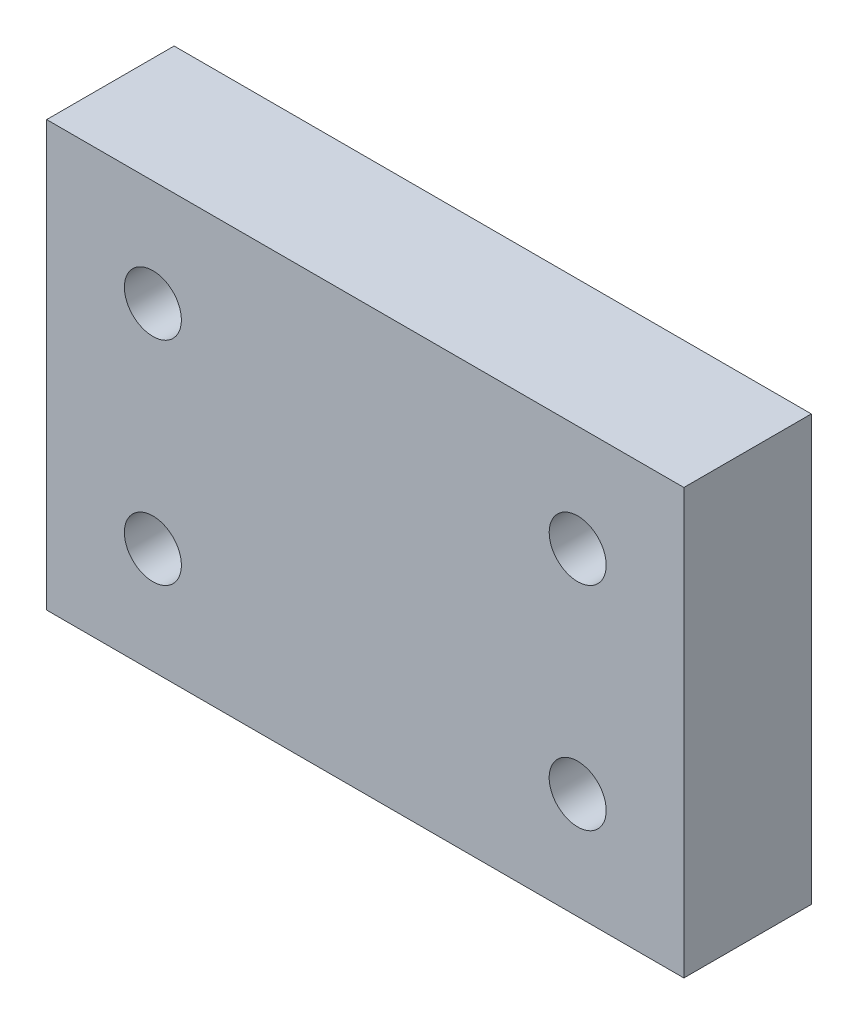
ISO-10303-21;
HEADER;
FILE_DESCRIPTION(('STEP AP214'),'2;1');
FILE_NAME('part.step','',(''),(''),'','','');
FILE_SCHEMA(('AUTOMOTIVE_DESIGN { 1 0 10303 214 1 1 1 1 }'));
ENDSEC;
DATA;
#1=APPLICATION_CONTEXT('core data for automotive mechanical design processes');
#2=APPLICATION_PROTOCOL_DEFINITION('international standard','automotive_design',2000,#1);
#3=PRODUCT_CONTEXT('',#1,'mechanical');
#4=PRODUCT('Part','Part','',(#3));
#5=PRODUCT_RELATED_PRODUCT_CATEGORY('part','',(#4));
#6=PRODUCT_DEFINITION_FORMATION('','',#4);
#7=PRODUCT_DEFINITION_CONTEXT('part definition',#1,'design');
#8=PRODUCT_DEFINITION('design','',#6,#7);
#9=PRODUCT_DEFINITION_SHAPE('','',#8);
#10=(LENGTH_UNIT() NAMED_UNIT(*) SI_UNIT(.MILLI.,.METRE.));
#11=(NAMED_UNIT(*) PLANE_ANGLE_UNIT() SI_UNIT($,.RADIAN.));
#12=(NAMED_UNIT(*) SI_UNIT($,.STERADIAN.) SOLID_ANGLE_UNIT());
#13=UNCERTAINTY_MEASURE_WITH_UNIT(LENGTH_MEASURE(1.E-05),#10,'distance_accuracy_value','');
#14=(GEOMETRIC_REPRESENTATION_CONTEXT(3) GLOBAL_UNCERTAINTY_ASSIGNED_CONTEXT((#13)) GLOBAL_UNIT_ASSIGNED_CONTEXT((#10,
#11,#12)) REPRESENTATION_CONTEXT('',''));
#15=CARTESIAN_POINT('',(0.,0.,0.));
#16=DIRECTION('',(0.,0.,1.));
#17=DIRECTION('',(1.,0.,0.));
#18=AXIS2_PLACEMENT_3D('',#15,#16,#17);
#19=CARTESIAN_POINT('',(0.,0.,6.));
#20=DIRECTION('',(0.,0.,-1.));
#21=DIRECTION('',(-1.,0.,0.));
#22=AXIS2_PLACEMENT_3D('',#19,#20,#21);
#23=PLANE('',#22);
#24=CARTESIAN_POINT('',(25.,5.,6.));
#25=DIRECTION('',(0.,0.,1.));
#26=DIRECTION('',(1.,0.,0.));
#27=AXIS2_PLACEMENT_3D('',#24,#25,#26);
#28=CIRCLE('',#27,1.34180855128207);
#29=CARTESIAN_POINT('',(26.3418085512821,5.,6.));
#30=VERTEX_POINT('',#29);
#31=EDGE_CURVE('E120',#30,#30,#28,.T.);
#32=ORIENTED_EDGE('',*,*,#31,.F.);
#33=EDGE_LOOP('',(#32));
#34=FACE_BOUND('',#33,.T.);
#35=CARTESIAN_POINT('',(5.,15.,6.));
#36=DIRECTION('',(0.,0.,1.));
#37=DIRECTION('',(1.,0.,0.));
#38=AXIS2_PLACEMENT_3D('',#35,#36,#37);
#39=CIRCLE('',#38,1.34180855128207);
#40=CARTESIAN_POINT('',(6.34180855128207,15.,6.));
#41=VERTEX_POINT('',#40);
#42=EDGE_CURVE('E99',#41,#41,#39,.T.);
#43=ORIENTED_EDGE('',*,*,#42,.F.);
#44=EDGE_LOOP('',(#43));
#45=FACE_BOUND('',#44,.T.);
#46=DIRECTION('',(0.,-1.,0.));
#47=VECTOR('',#46,1.);
#48=CARTESIAN_POINT('',(0.,0.,6.));
#49=LINE('',#48,#47);
#50=CARTESIAN_POINT('',(0.,20.,6.));
#51=VERTEX_POINT('',#50);
#52=CARTESIAN_POINT('',(0.,0.,6.));
#53=VERTEX_POINT('',#52);
#54=EDGE_CURVE('E84',#51,#53,#49,.T.);
#55=ORIENTED_EDGE('',*,*,#54,.T.);
#56=DIRECTION('',(1.,0.,0.));
#57=VECTOR('',#56,1.);
#58=CARTESIAN_POINT('',(0.,0.,6.));
#59=LINE('',#58,#57);
#60=CARTESIAN_POINT('',(30.,0.,6.));
#61=VERTEX_POINT('',#60);
#62=EDGE_CURVE('E79',#53,#61,#59,.T.);
#63=ORIENTED_EDGE('',*,*,#62,.T.);
#64=DIRECTION('',(0.,1.,0.));
#65=VECTOR('',#64,1.);
#66=CARTESIAN_POINT('',(30.,0.,6.));
#67=LINE('',#66,#65);
#68=CARTESIAN_POINT('',(30.,20.,6.));
#69=VERTEX_POINT('',#68);
#70=EDGE_CURVE('E82',#61,#69,#67,.T.);
#71=ORIENTED_EDGE('',*,*,#70,.T.);
#72=DIRECTION('',(-1.,0.,0.));
#73=VECTOR('',#72,1.);
#74=CARTESIAN_POINT('',(0.,20.,6.));
#75=LINE('',#74,#73);
#76=EDGE_CURVE('E49',#69,#51,#75,.T.);
#77=ORIENTED_EDGE('',*,*,#76,.T.);
#78=EDGE_LOOP('',(#55,#63,#71,#77));
#79=FACE_BOUND('',#78,.T.);
#80=CARTESIAN_POINT('',(25.,15.,6.));
#81=DIRECTION('',(0.,0.,1.));
#82=DIRECTION('',(-1.,0.,0.));
#83=AXIS2_PLACEMENT_3D('',#80,#81,#82);
#84=CIRCLE('',#83,1.34180855128207);
#85=CARTESIAN_POINT('',(23.6581914487179,15.,6.));
#86=VERTEX_POINT('',#85);
#87=EDGE_CURVE('E114',#86,#86,#84,.T.);
#88=ORIENTED_EDGE('',*,*,#87,.F.);
#89=EDGE_LOOP('',(#88));
#90=FACE_BOUND('',#89,.T.);
#91=CARTESIAN_POINT('',(5.,5.,6.));
#92=DIRECTION('',(0.,0.,1.));
#93=DIRECTION('',(-1.,0.,0.));
#94=AXIS2_PLACEMENT_3D('',#91,#92,#93);
#95=CIRCLE('',#94,1.34180855128207);
#96=CARTESIAN_POINT('',(3.65819144871793,5.,6.));
#97=VERTEX_POINT('',#96);
#98=EDGE_CURVE('E126',#97,#97,#95,.T.);
#99=ORIENTED_EDGE('',*,*,#98,.F.);
#100=EDGE_LOOP('',(#99));
#101=FACE_BOUND('',#100,.T.);
#102=ADVANCED_FACE('F32',(#34,#45,#79,#90,#101),#23,.F.);
#103=CARTESIAN_POINT('',(0.,0.,0.));
#104=DIRECTION('',(0.,0.,-1.));
#105=DIRECTION('',(-1.,0.,0.));
#106=AXIS2_PLACEMENT_3D('',#103,#104,#105);
#107=PLANE('',#106);
#108=CARTESIAN_POINT('',(25.,5.,0.));
#109=DIRECTION('',(0.,0.,1.));
#110=DIRECTION('',(1.,0.,0.));
#111=AXIS2_PLACEMENT_3D('',#108,#109,#110);
#112=CIRCLE('',#111,1.34180855128207);
#113=CARTESIAN_POINT('',(26.3418085512821,5.,0.));
#114=VERTEX_POINT('',#113);
#115=EDGE_CURVE('E123',#114,#114,#112,.T.);
#116=ORIENTED_EDGE('',*,*,#115,.T.);
#117=EDGE_LOOP('',(#116));
#118=FACE_BOUND('',#117,.T.);
#119=CARTESIAN_POINT('',(5.,15.,0.));
#120=DIRECTION('',(0.,0.,1.));
#121=DIRECTION('',(1.,0.,0.));
#122=AXIS2_PLACEMENT_3D('',#119,#120,#121);
#123=CIRCLE('',#122,1.34180855128207);
#124=CARTESIAN_POINT('',(6.34180855128207,15.,0.));
#125=VERTEX_POINT('',#124);
#126=EDGE_CURVE('E111',#125,#125,#123,.T.);
#127=ORIENTED_EDGE('',*,*,#126,.T.);
#128=EDGE_LOOP('',(#127));
#129=FACE_BOUND('',#128,.T.);
#130=DIRECTION('',(0.,-1.,0.));
#131=VECTOR('',#130,1.);
#132=CARTESIAN_POINT('',(0.,0.,0.));
#133=LINE('',#132,#131);
#134=CARTESIAN_POINT('',(0.,20.,0.));
#135=VERTEX_POINT('',#134);
#136=CARTESIAN_POINT('',(0.,0.,0.));
#137=VERTEX_POINT('',#136);
#138=EDGE_CURVE('E96',#135,#137,#133,.T.);
#139=ORIENTED_EDGE('',*,*,#138,.F.);
#140=DIRECTION('',(-1.,0.,0.));
#141=VECTOR('',#140,1.);
#142=CARTESIAN_POINT('',(0.,20.,0.));
#143=LINE('',#142,#141);
#144=CARTESIAN_POINT('',(30.,20.,0.));
#145=VERTEX_POINT('',#144);
#146=EDGE_CURVE('E72',#145,#135,#143,.T.);
#147=ORIENTED_EDGE('',*,*,#146,.F.);
#148=DIRECTION('',(0.,1.,0.));
#149=VECTOR('',#148,1.);
#150=CARTESIAN_POINT('',(30.,0.,0.));
#151=LINE('',#150,#149);
#152=CARTESIAN_POINT('',(30.,0.,0.));
#153=VERTEX_POINT('',#152);
#154=EDGE_CURVE('E66',#153,#145,#151,.T.);
#155=ORIENTED_EDGE('',*,*,#154,.F.);
#156=DIRECTION('',(1.,0.,0.));
#157=VECTOR('',#156,1.);
#158=CARTESIAN_POINT('',(0.,0.,0.));
#159=LINE('',#158,#157);
#160=EDGE_CURVE('E88',#137,#153,#159,.T.);
#161=ORIENTED_EDGE('',*,*,#160,.F.);
#162=EDGE_LOOP('',(#139,#147,#155,#161));
#163=FACE_BOUND('',#162,.T.);
#164=CARTESIAN_POINT('',(25.,15.,0.));
#165=DIRECTION('',(0.,0.,1.));
#166=DIRECTION('',(-1.,0.,0.));
#167=AXIS2_PLACEMENT_3D('',#164,#165,#166);
#168=CIRCLE('',#167,1.34180855128207);
#169=CARTESIAN_POINT('',(23.6581914487179,15.,0.));
#170=VERTEX_POINT('',#169);
#171=EDGE_CURVE('E117',#170,#170,#168,.T.);
#172=ORIENTED_EDGE('',*,*,#171,.T.);
#173=EDGE_LOOP('',(#172));
#174=FACE_BOUND('',#173,.T.);
#175=CARTESIAN_POINT('',(5.,5.,0.));
#176=DIRECTION('',(0.,0.,1.));
#177=DIRECTION('',(-1.,0.,0.));
#178=AXIS2_PLACEMENT_3D('',#175,#176,#177);
#179=CIRCLE('',#178,1.34180855128207);
#180=CARTESIAN_POINT('',(3.65819144871793,5.,0.));
#181=VERTEX_POINT('',#180);
#182=EDGE_CURVE('E129',#181,#181,#179,.T.);
#183=ORIENTED_EDGE('',*,*,#182,.T.);
#184=EDGE_LOOP('',(#183));
#185=FACE_BOUND('',#184,.T.);
#186=ADVANCED_FACE('F107',(#118,#129,#163,#174,#185),#107,.T.);
#187=CARTESIAN_POINT('',(0.,0.,6.));
#188=DIRECTION('',(1.,0.,0.));
#189=DIRECTION('',(0.,0.,-1.));
#190=AXIS2_PLACEMENT_3D('',#187,#188,#189);
#191=PLANE('',#190);
#192=ORIENTED_EDGE('',*,*,#138,.T.);
#193=DIRECTION('',(0.,0.,-1.));
#194=VECTOR('',#193,1.);
#195=CARTESIAN_POINT('',(0.,0.,6.));
#196=LINE('',#195,#194);
#197=EDGE_CURVE('E11',#53,#137,#196,.T.);
#198=ORIENTED_EDGE('',*,*,#197,.F.);
#199=ORIENTED_EDGE('',*,*,#54,.F.);
#200=DIRECTION('',(0.,0.,-1.));
#201=VECTOR('',#200,1.);
#202=CARTESIAN_POINT('',(0.,20.,6.));
#203=LINE('',#202,#201);
#204=EDGE_CURVE('E92',#51,#135,#203,.T.);
#205=ORIENTED_EDGE('',*,*,#204,.T.);
#206=EDGE_LOOP('',(#192,#198,#199,#205));
#207=FACE_BOUND('',#206,.T.);
#208=ADVANCED_FACE('F34',(#207),#191,.F.);
#209=CARTESIAN_POINT('',(0.,0.,6.));
#210=DIRECTION('',(0.,1.,0.));
#211=DIRECTION('',(0.,0.,1.));
#212=AXIS2_PLACEMENT_3D('',#209,#210,#211);
#213=PLANE('',#212);
#214=ORIENTED_EDGE('',*,*,#160,.T.);
#215=DIRECTION('',(0.,0.,-1.));
#216=VECTOR('',#215,1.);
#217=CARTESIAN_POINT('',(30.,0.,6.));
#218=LINE('',#217,#216);
#219=EDGE_CURVE('E41',#61,#153,#218,.T.);
#220=ORIENTED_EDGE('',*,*,#219,.F.);
#221=ORIENTED_EDGE('',*,*,#62,.F.);
#222=ORIENTED_EDGE('',*,*,#197,.T.);
#223=EDGE_LOOP('',(#214,#220,#221,#222));
#224=FACE_BOUND('',#223,.T.);
#225=ADVANCED_FACE('F87',(#224),#213,.F.);
#226=CARTESIAN_POINT('',(30.,0.,6.));
#227=DIRECTION('',(-1.,0.,0.));
#228=DIRECTION('',(0.,0.,1.));
#229=AXIS2_PLACEMENT_3D('',#226,#227,#228);
#230=PLANE('',#229);
#231=ORIENTED_EDGE('',*,*,#154,.T.);
#232=DIRECTION('',(0.,0.,-1.));
#233=VECTOR('',#232,1.);
#234=CARTESIAN_POINT('',(30.,20.,6.));
#235=LINE('',#234,#233);
#236=EDGE_CURVE('E89',#69,#145,#235,.T.);
#237=ORIENTED_EDGE('',*,*,#236,.F.);
#238=ORIENTED_EDGE('',*,*,#70,.F.);
#239=ORIENTED_EDGE('',*,*,#219,.T.);
#240=EDGE_LOOP('',(#231,#237,#238,#239));
#241=FACE_BOUND('',#240,.T.);
#242=ADVANCED_FACE('F90',(#241),#230,.F.);
#243=CARTESIAN_POINT('',(0.,20.,6.));
#244=DIRECTION('',(0.,-1.,0.));
#245=DIRECTION('',(0.,0.,-1.));
#246=AXIS2_PLACEMENT_3D('',#243,#244,#245);
#247=PLANE('',#246);
#248=ORIENTED_EDGE('',*,*,#146,.T.);
#249=ORIENTED_EDGE('',*,*,#204,.F.);
#250=ORIENTED_EDGE('',*,*,#76,.F.);
#251=ORIENTED_EDGE('',*,*,#236,.T.);
#252=EDGE_LOOP('',(#248,#249,#250,#251));
#253=FACE_BOUND('',#252,.T.);
#254=ADVANCED_FACE('F104',(#253),#247,.F.);
#255=CARTESIAN_POINT('',(5.,15.,6.));
#256=DIRECTION('',(0.,0.,-1.));
#257=DIRECTION('',(-1.,0.,0.));
#258=AXIS2_PLACEMENT_3D('',#255,#256,#257);
#259=CYLINDRICAL_SURFACE('',#258,1.34180855128207);
#260=ORIENTED_EDGE('',*,*,#42,.T.);
#261=EDGE_LOOP('',(#260));
#262=FACE_BOUND('',#261,.T.);
#263=ORIENTED_EDGE('',*,*,#126,.F.);
#264=EDGE_LOOP('',(#263));
#265=FACE_BOUND('',#264,.T.);
#266=ADVANCED_FACE('F149',(#262,#265),#259,.F.);
#267=CARTESIAN_POINT('',(25.,15.,6.));
#268=DIRECTION('',(0.,0.,-1.));
#269=DIRECTION('',(-1.,0.,0.));
#270=AXIS2_PLACEMENT_3D('',#267,#268,#269);
#271=CYLINDRICAL_SURFACE('',#270,1.34180855128207);
#272=ORIENTED_EDGE('',*,*,#87,.T.);
#273=EDGE_LOOP('',(#272));
#274=FACE_BOUND('',#273,.T.);
#275=ORIENTED_EDGE('',*,*,#171,.F.);
#276=EDGE_LOOP('',(#275));
#277=FACE_BOUND('',#276,.T.);
#278=ADVANCED_FACE('F195',(#274,#277),#271,.F.);
#279=CARTESIAN_POINT('',(25.,5.,6.));
#280=DIRECTION('',(0.,0.,-1.));
#281=DIRECTION('',(-1.,0.,0.));
#282=AXIS2_PLACEMENT_3D('',#279,#280,#281);
#283=CYLINDRICAL_SURFACE('',#282,1.34180855128207);
#284=ORIENTED_EDGE('',*,*,#31,.T.);
#285=EDGE_LOOP('',(#284));
#286=FACE_BOUND('',#285,.T.);
#287=ORIENTED_EDGE('',*,*,#115,.F.);
#288=EDGE_LOOP('',(#287));
#289=FACE_BOUND('',#288,.T.);
#290=ADVANCED_FACE('F203',(#286,#289),#283,.F.);
#291=CARTESIAN_POINT('',(5.,5.,6.));
#292=DIRECTION('',(0.,0.,-1.));
#293=DIRECTION('',(-1.,0.,0.));
#294=AXIS2_PLACEMENT_3D('',#291,#292,#293);
#295=CYLINDRICAL_SURFACE('',#294,1.34180855128207);
#296=ORIENTED_EDGE('',*,*,#98,.T.);
#297=EDGE_LOOP('',(#296));
#298=FACE_BOUND('',#297,.T.);
#299=ORIENTED_EDGE('',*,*,#182,.F.);
#300=EDGE_LOOP('',(#299));
#301=FACE_BOUND('',#300,.T.);
#302=ADVANCED_FACE('F135',(#298,#301),#295,.F.);
#303=CLOSED_SHELL('',(#102,#186,#208,#225,#242,#254,#266,#278,#290,#302));
#304=MANIFOLD_SOLID_BREP('B2',#303);
#305=ADVANCED_BREP_SHAPE_REPRESENTATION('',(#18,#304),#14);
#306=SHAPE_DEFINITION_REPRESENTATION(#9,#305);
ENDSEC;
END-ISO-10303-21;
